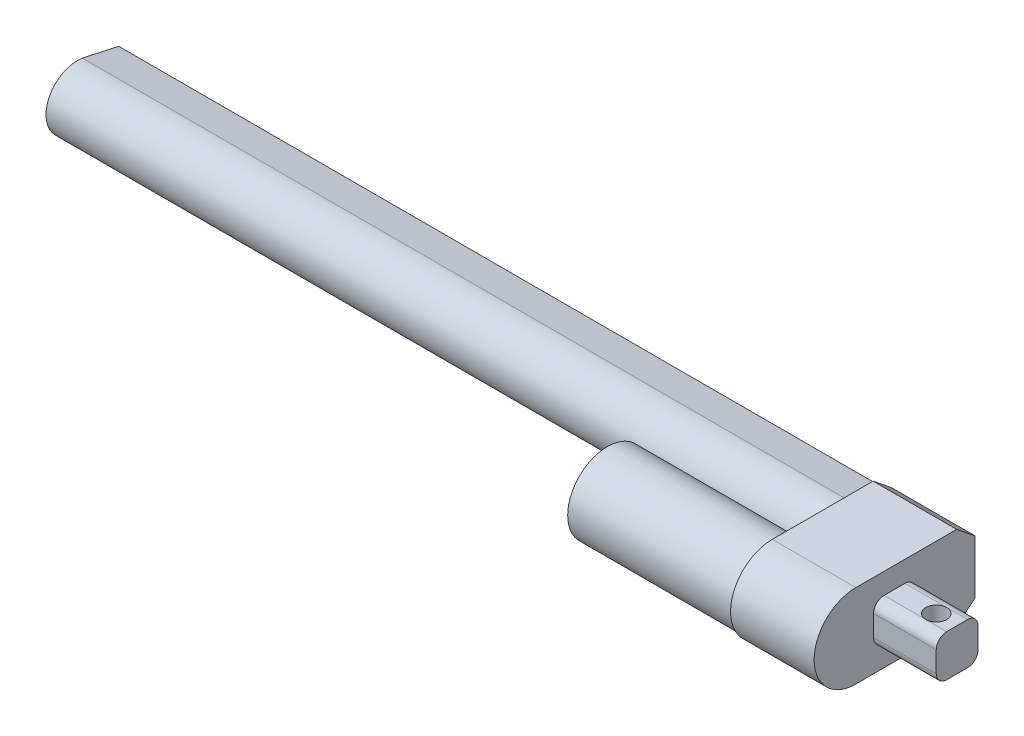
ISO-10303-21;
HEADER;
FILE_DESCRIPTION(('STEP AP214'),'2;1');
FILE_NAME('part.step','',(''),(''),'','','');
FILE_SCHEMA(('AUTOMOTIVE_DESIGN { 1 0 10303 214 1 1 1 1 }'));
ENDSEC;
DATA;
#1=APPLICATION_CONTEXT('core data for automotive mechanical design processes');
#2=APPLICATION_PROTOCOL_DEFINITION('international standard','automotive_design',2000,#1);
#3=PRODUCT_CONTEXT('',#1,'mechanical');
#4=PRODUCT('Part','Part','',(#3));
#5=PRODUCT_RELATED_PRODUCT_CATEGORY('part','',(#4));
#6=PRODUCT_DEFINITION_FORMATION('','',#4);
#7=PRODUCT_DEFINITION_CONTEXT('part definition',#1,'design');
#8=PRODUCT_DEFINITION('design','',#6,#7);
#9=PRODUCT_DEFINITION_SHAPE('','',#8);
#10=(LENGTH_UNIT() NAMED_UNIT(*) SI_UNIT(.MILLI.,.METRE.));
#11=(NAMED_UNIT(*) PLANE_ANGLE_UNIT() SI_UNIT($,.RADIAN.));
#12=(NAMED_UNIT(*) SI_UNIT($,.STERADIAN.) SOLID_ANGLE_UNIT());
#13=UNCERTAINTY_MEASURE_WITH_UNIT(LENGTH_MEASURE(1.E-05),#10,'distance_accuracy_value','');
#14=(GEOMETRIC_REPRESENTATION_CONTEXT(3) GLOBAL_UNCERTAINTY_ASSIGNED_CONTEXT((#13)) GLOBAL_UNIT_ASSIGNED_CONTEXT((#10,
#11,#12)) REPRESENTATION_CONTEXT('',''));
#15=CARTESIAN_POINT('',(0.,0.,0.));
#16=DIRECTION('',(0.,0.,1.));
#17=DIRECTION('',(1.,0.,0.));
#18=AXIS2_PLACEMENT_3D('',#15,#16,#17);
#19=CARTESIAN_POINT('',(440.,-1.00000000000001,43.5));
#20=DIRECTION('',(0.,-1.,0.));
#21=DIRECTION('',(0.,0.,-1.));
#22=AXIS2_PLACEMENT_3D('',#19,#20,#21);
#23=PLANE('',#22);
#24=DIRECTION('',(-1.,0.,0.));
#25=VECTOR('',#24,1.);
#26=CARTESIAN_POINT('',(440.,-1.00000000000001,33.5));
#27=LINE('',#26,#25);
#28=CARTESIAN_POINT('',(440.,-1.00000000000001,33.5));
#29=VERTEX_POINT('',#28);
#30=CARTESIAN_POINT('',(430.,-1.00000000000001,33.5));
#31=VERTEX_POINT('',#30);
#32=EDGE_CURVE('E184',#29,#31,#27,.T.);
#33=ORIENTED_EDGE('',*,*,#32,.T.);
#34=CARTESIAN_POINT('',(430.,-1.00000000000001,38.5));
#35=DIRECTION('',(0.,1.,0.));
#36=DIRECTION('',(0.,0.,1.));
#37=AXIS2_PLACEMENT_3D('',#34,#35,#36);
#38=CIRCLE('',#37,4.99999999999999);
#39=CARTESIAN_POINT('',(430.,-1.00000000000001,43.5));
#40=VERTEX_POINT('',#39);
#41=EDGE_CURVE('E50',#40,#31,#38,.T.);
#42=ORIENTED_EDGE('',*,*,#41,.F.);
#43=DIRECTION('',(-1.,0.,0.));
#44=VECTOR('',#43,1.);
#45=CARTESIAN_POINT('',(440.,-1.00000000000001,43.5));
#46=LINE('',#45,#44);
#47=CARTESIAN_POINT('',(440.,-1.00000000000001,43.5));
#48=VERTEX_POINT('',#47);
#49=EDGE_CURVE('E181',#48,#40,#46,.T.);
#50=ORIENTED_EDGE('',*,*,#49,.F.);
#51=DIRECTION('',(0.,0.,1.));
#52=VECTOR('',#51,1.);
#53=CARTESIAN_POINT('',(440.,-1.00000000000001,43.5));
#54=LINE('',#53,#52);
#55=EDGE_CURVE('E348',#29,#48,#54,.T.);
#56=ORIENTED_EDGE('',*,*,#55,.F.);
#57=EDGE_LOOP('',(#33,#42,#50,#56));
#58=FACE_BOUND('',#57,.T.);
#59=ADVANCED_FACE('F36',(#58),#23,.F.);
#60=CARTESIAN_POINT('',(440.,-21.,43.5));
#61=DIRECTION('',(0.,1.,0.));
#62=DIRECTION('',(0.,0.,1.));
#63=AXIS2_PLACEMENT_3D('',#60,#61,#62);
#64=PLANE('',#63);
#65=DIRECTION('',(-1.,0.,0.));
#66=VECTOR('',#65,1.);
#67=CARTESIAN_POINT('',(440.,-21.,43.5));
#68=LINE('',#67,#66);
#69=CARTESIAN_POINT('',(440.,-21.,43.5));
#70=VERTEX_POINT('',#69);
#71=CARTESIAN_POINT('',(430.,-21.,43.5));
#72=VERTEX_POINT('',#71);
#73=EDGE_CURVE('E298',#70,#72,#68,.T.);
#74=ORIENTED_EDGE('',*,*,#73,.T.);
#75=CARTESIAN_POINT('',(430.,-21.,38.5));
#76=DIRECTION('',(0.,1.,0.));
#77=DIRECTION('',(0.,0.,1.));
#78=AXIS2_PLACEMENT_3D('',#75,#76,#77);
#79=CIRCLE('',#78,4.99999999999999);
#80=CARTESIAN_POINT('',(430.,-21.,33.5));
#81=VERTEX_POINT('',#80);
#82=EDGE_CURVE('E44',#72,#81,#79,.T.);
#83=ORIENTED_EDGE('',*,*,#82,.T.);
#84=DIRECTION('',(-1.,0.,0.));
#85=VECTOR('',#84,1.);
#86=CARTESIAN_POINT('',(440.,-21.,33.5));
#87=LINE('',#86,#85);
#88=CARTESIAN_POINT('',(440.,-21.,33.5));
#89=VERTEX_POINT('',#88);
#90=EDGE_CURVE('E295',#89,#81,#87,.T.);
#91=ORIENTED_EDGE('',*,*,#90,.F.);
#92=DIRECTION('',(0.,0.,-1.));
#93=VECTOR('',#92,1.);
#94=CARTESIAN_POINT('',(440.,-21.,43.5));
#95=LINE('',#94,#93);
#96=EDGE_CURVE('E309',#70,#89,#95,.T.);
#97=ORIENTED_EDGE('',*,*,#96,.F.);
#98=EDGE_LOOP('',(#74,#83,#91,#97));
#99=FACE_BOUND('',#98,.T.);
#100=ADVANCED_FACE('F292',(#99),#64,.F.);
#101=CARTESIAN_POINT('',(370.,0.,0.));
#102=DIRECTION('',(0.,0.,-1.));
#103=DIRECTION('',(0.,1.,0.));
#104=AXIS2_PLACEMENT_3D('',#101,#102,#103);
#105=PLANE('',#104);
#106=DIRECTION('',(0.,-1.,0.));
#107=VECTOR('',#106,1.);
#108=CARTESIAN_POINT('',(0.,0.,0.));
#109=LINE('',#108,#107);
#110=CARTESIAN_POINT('',(0.,0.,0.));
#111=VERTEX_POINT('',#110);
#112=CARTESIAN_POINT('',(0.,-22.,0.));
#113=VERTEX_POINT('',#112);
#114=EDGE_CURVE('E259',#111,#113,#109,.T.);
#115=ORIENTED_EDGE('',*,*,#114,.F.);
#116=DIRECTION('',(-1.,0.,0.));
#117=VECTOR('',#116,1.);
#118=CARTESIAN_POINT('',(370.,0.,0.));
#119=LINE('',#118,#117);
#120=CARTESIAN_POINT('',(370.,0.,0.));
#121=VERTEX_POINT('',#120);
#122=EDGE_CURVE('E282',#121,#111,#119,.T.);
#123=ORIENTED_EDGE('',*,*,#122,.F.);
#124=DIRECTION('',(0.,1.,0.));
#125=VECTOR('',#124,1.);
#126=CARTESIAN_POINT('',(370.,-11.,0.));
#127=LINE('',#126,#125);
#128=CARTESIAN_POINT('',(370.,2.,0.));
#129=VERTEX_POINT('',#128);
#130=EDGE_CURVE('E210',#121,#129,#127,.T.);
#131=ORIENTED_EDGE('',*,*,#130,.T.);
#132=DIRECTION('',(-1.,0.,0.));
#133=VECTOR('',#132,1.);
#134=CARTESIAN_POINT('',(410.,2.,0.));
#135=LINE('',#134,#133);
#136=CARTESIAN_POINT('',(410.,2.,0.));
#137=VERTEX_POINT('',#136);
#138=EDGE_CURVE('E252',#137,#129,#135,.T.);
#139=ORIENTED_EDGE('',*,*,#138,.F.);
#140=DIRECTION('',(0.,1.,0.));
#141=VECTOR('',#140,1.);
#142=CARTESIAN_POINT('',(410.,-24.,0.));
#143=LINE('',#142,#141);
#144=CARTESIAN_POINT('',(410.,-24.,0.));
#145=VERTEX_POINT('',#144);
#146=EDGE_CURVE('E211',#145,#137,#143,.T.);
#147=ORIENTED_EDGE('',*,*,#146,.F.);
#148=DIRECTION('',(-1.,0.,0.));
#149=VECTOR('',#148,1.);
#150=CARTESIAN_POINT('',(410.,-24.,0.));
#151=LINE('',#150,#149);
#152=CARTESIAN_POINT('',(370.,-24.,0.));
#153=VERTEX_POINT('',#152);
#154=EDGE_CURVE('E224',#145,#153,#151,.T.);
#155=ORIENTED_EDGE('',*,*,#154,.T.);
#156=CARTESIAN_POINT('',(370.,-22.,0.));
#157=VERTEX_POINT('',#156);
#158=EDGE_CURVE('E225',#153,#157,#127,.T.);
#159=ORIENTED_EDGE('',*,*,#158,.T.);
#160=DIRECTION('',(-1.,0.,0.));
#161=VECTOR('',#160,1.);
#162=CARTESIAN_POINT('',(370.,-22.,0.));
#163=LINE('',#162,#161);
#164=EDGE_CURVE('E271',#157,#113,#163,.T.);
#165=ORIENTED_EDGE('',*,*,#164,.T.);
#166=EDGE_LOOP('',(#115,#123,#131,#139,#147,#155,#159,#165));
#167=FACE_BOUND('',#166,.T.);
#168=ADVANCED_FACE('F38',(#167),#105,.T.);
#169=CARTESIAN_POINT('',(370.,0.,0.));
#170=DIRECTION('',(0.,-0.976971020538512,0.213372034315506));
#171=DIRECTION('',(0.,-0.213372034315506,-0.976971020538513));
#172=AXIS2_PLACEMENT_3D('',#169,#170,#171);
#173=PLANE('',#172);
#174=DIRECTION('',(0.,0.213372034315506,0.976971020538513));
#175=VECTOR('',#174,1.);
#176=CARTESIAN_POINT('',(0.,0.,0.));
#177=LINE('',#176,#175);
#178=CARTESIAN_POINT('',(0.,3.8039516146193,17.4172332514696));
#179=VERTEX_POINT('',#178);
#180=EDGE_CURVE('E266',#111,#179,#177,.T.);
#181=ORIENTED_EDGE('',*,*,#180,.T.);
#182=DIRECTION('',(-1.,0.,0.));
#183=VECTOR('',#182,1.);
#184=CARTESIAN_POINT('',(370.,3.8039516146193,17.4172332514696));
#185=LINE('',#184,#183);
#186=CARTESIAN_POINT('',(370.,3.8039516146193,17.4172332514696));
#187=VERTEX_POINT('',#186);
#188=EDGE_CURVE('E284',#187,#179,#185,.T.);
#189=ORIENTED_EDGE('',*,*,#188,.F.);
#190=DIRECTION('',(0.,0.213372034315506,0.976971020538513));
#191=VECTOR('',#190,1.);
#192=CARTESIAN_POINT('',(370.,0.,0.));
#193=LINE('',#192,#191);
#194=EDGE_CURVE('E269',#121,#187,#193,.T.);
#195=ORIENTED_EDGE('',*,*,#194,.F.);
#196=ORIENTED_EDGE('',*,*,#122,.T.);
#197=EDGE_LOOP('',(#181,#189,#195,#196));
#198=FACE_BOUND('',#197,.T.);
#199=ADVANCED_FACE('F436',(#198),#173,.F.);
#200=CARTESIAN_POINT('',(370.,-11.,19.8344665029393));
#201=DIRECTION('',(-1.,0.,0.));
#202=DIRECTION('',(0.,0.,1.));
#203=AXIS2_PLACEMENT_3D('',#200,#201,#202);
#204=CYLINDRICAL_SURFACE('',#203,15.);
#205=CARTESIAN_POINT('',(0.,-11.,19.8344665029393));
#206=DIRECTION('',(-1.,0.,0.));
#207=DIRECTION('',(0.,0.,1.));
#208=AXIS2_PLACEMENT_3D('',#205,#206,#207);
#209=CIRCLE('',#208,15.);
#210=CARTESIAN_POINT('',(0.,-25.8039516146193,17.4172332514696));
#211=VERTEX_POINT('',#210);
#212=EDGE_CURVE('E277',#211,#179,#209,.T.);
#213=ORIENTED_EDGE('',*,*,#212,.F.);
#214=DIRECTION('',(-1.,0.,0.));
#215=VECTOR('',#214,1.);
#216=CARTESIAN_POINT('',(370.,-25.8039516146193,17.4172332514696));
#217=LINE('',#216,#215);
#218=CARTESIAN_POINT('',(370.,-25.8039516146193,17.4172332514696));
#219=VERTEX_POINT('',#218);
#220=EDGE_CURVE('E286',#219,#211,#217,.T.);
#221=ORIENTED_EDGE('',*,*,#220,.F.);
#222=CARTESIAN_POINT('',(370.,-11.,19.8344665029393));
#223=DIRECTION('',(-1.,0.,0.));
#224=DIRECTION('',(0.,0.,1.));
#225=AXIS2_PLACEMENT_3D('',#222,#223,#224);
#226=CIRCLE('',#225,15.);
#227=EDGE_CURVE('E265',#219,#187,#226,.T.);
#228=ORIENTED_EDGE('',*,*,#227,.T.);
#229=ORIENTED_EDGE('',*,*,#188,.T.);
#230=EDGE_LOOP('',(#213,#221,#228,#229));
#231=FACE_BOUND('',#230,.T.);
#232=ADVANCED_FACE('F439',(#231),#204,.T.);
#233=CARTESIAN_POINT('',(370.,-22.,0.));
#234=DIRECTION('',(0.,-0.976971020538512,-0.213372034315506));
#235=DIRECTION('',(0.,0.213372034315506,-0.976971020538512));
#236=AXIS2_PLACEMENT_3D('',#233,#234,#235);
#237=PLANE('',#236);
#238=DIRECTION('',(0.,-0.213372034315506,0.976971020538512));
#239=VECTOR('',#238,1.);
#240=CARTESIAN_POINT('',(0.,-22.,0.));
#241=LINE('',#240,#239);
#242=EDGE_CURVE('E274',#113,#211,#241,.T.);
#243=ORIENTED_EDGE('',*,*,#242,.F.);
#244=ORIENTED_EDGE('',*,*,#164,.F.);
#245=DIRECTION('',(0.,-0.213372034315506,0.976971020538512));
#246=VECTOR('',#245,1.);
#247=CARTESIAN_POINT('',(370.,-22.,0.));
#248=LINE('',#247,#246);
#249=EDGE_CURVE('E262',#157,#219,#248,.T.);
#250=ORIENTED_EDGE('',*,*,#249,.T.);
#251=ORIENTED_EDGE('',*,*,#220,.T.);
#252=EDGE_LOOP('',(#243,#244,#250,#251));
#253=FACE_BOUND('',#252,.T.);
#254=ADVANCED_FACE('F434',(#253),#237,.T.);
#255=CARTESIAN_POINT('',(0.,-11.,19.8344665029393));
#256=DIRECTION('',(-1.,0.,0.));
#257=DIRECTION('',(0.,0.,1.));
#258=AXIS2_PLACEMENT_3D('',#255,#256,#257);
#259=PLANE('',#258);
#260=CARTESIAN_POINT('',(0.,-11.,19.82));
#261=DIRECTION('',(-1.,0.,0.));
#262=DIRECTION('',(0.,0.,1.));
#263=AXIS2_PLACEMENT_3D('',#260,#261,#262);
#264=CIRCLE('',#263,10.);
#265=CARTESIAN_POINT('',(0.,-11.,29.82));
#266=VERTEX_POINT('',#265);
#267=EDGE_CURVE('E255',#266,#266,#264,.T.);
#268=ORIENTED_EDGE('',*,*,#267,.F.);
#269=EDGE_LOOP('',(#268));
#270=FACE_BOUND('',#269,.T.);
#271=ORIENTED_EDGE('',*,*,#114,.T.);
#272=ORIENTED_EDGE('',*,*,#242,.T.);
#273=ORIENTED_EDGE('',*,*,#212,.T.);
#274=ORIENTED_EDGE('',*,*,#180,.F.);
#275=EDGE_LOOP('',(#271,#272,#273,#274));
#276=FACE_BOUND('',#275,.T.);
#277=ADVANCED_FACE('F430',(#270,#276),#259,.T.);
#278=CARTESIAN_POINT('',(360.,-11.,19.82));
#279=DIRECTION('',(-1.,0.,0.));
#280=DIRECTION('',(0.,0.,1.));
#281=AXIS2_PLACEMENT_3D('',#278,#279,#280);
#282=CYLINDRICAL_SURFACE('',#281,10.);
#283=CARTESIAN_POINT('',(360.,-11.,19.82));
#284=DIRECTION('',(-1.,0.,0.));
#285=DIRECTION('',(0.,0.,1.));
#286=AXIS2_PLACEMENT_3D('',#283,#284,#285);
#287=CIRCLE('',#286,10.);
#288=CARTESIAN_POINT('',(360.,-11.,29.82));
#289=VERTEX_POINT('',#288);
#290=EDGE_CURVE('E256',#289,#289,#287,.T.);
#291=CARTESIAN_POINT('',(360.,-11.,29.82));
#292=CARTESIAN_POINT('',(356.25,-11.,29.82));
#293=CARTESIAN_POINT('',(352.5,-11.,29.82));
#294=CARTESIAN_POINT('',(345.,-11.,29.82));
#295=CARTESIAN_POINT('',(341.25,-11.,29.82));
#296=CARTESIAN_POINT('',(333.75,-11.,29.82));
#297=CARTESIAN_POINT('',(330.,-11.,29.82));
#298=CARTESIAN_POINT('',(322.5,-11.,29.82));
#299=CARTESIAN_POINT('',(318.75,-11.,29.82));
#300=CARTESIAN_POINT('',(311.25,-11.,29.82));
#301=CARTESIAN_POINT('',(307.5,-11.,29.82));
#302=CARTESIAN_POINT('',(300.,-11.,29.82));
#303=CARTESIAN_POINT('',(296.25,-11.,29.82));
#304=CARTESIAN_POINT('',(288.75,-11.,29.82));
#305=CARTESIAN_POINT('',(285.,-11.,29.82));
#306=CARTESIAN_POINT('',(277.5,-11.,29.82));
#307=CARTESIAN_POINT('',(273.75,-11.,29.82));
#308=CARTESIAN_POINT('',(266.25,-11.,29.82));
#309=CARTESIAN_POINT('',(262.5,-11.,29.82));
#310=CARTESIAN_POINT('',(255.,-11.,29.82));
#311=CARTESIAN_POINT('',(251.25,-11.,29.82));
#312=CARTESIAN_POINT('',(243.75,-11.,29.82));
#313=CARTESIAN_POINT('',(240.,-11.,29.82));
#314=CARTESIAN_POINT('',(232.5,-11.,29.82));
#315=CARTESIAN_POINT('',(228.75,-11.,29.82));
#316=CARTESIAN_POINT('',(221.25,-11.,29.82));
#317=CARTESIAN_POINT('',(217.5,-11.,29.82));
#318=CARTESIAN_POINT('',(210.,-11.,29.82));
#319=CARTESIAN_POINT('',(206.25,-11.,29.82));
#320=CARTESIAN_POINT('',(198.75,-11.,29.82));
#321=CARTESIAN_POINT('',(195.,-11.,29.82));
#322=CARTESIAN_POINT('',(187.5,-11.,29.82));
#323=CARTESIAN_POINT('',(183.75,-11.,29.82));
#324=CARTESIAN_POINT('',(176.25,-11.,29.82));
#325=CARTESIAN_POINT('',(172.5,-11.,29.82));
#326=CARTESIAN_POINT('',(165.,-11.,29.82));
#327=CARTESIAN_POINT('',(161.25,-11.,29.82));
#328=CARTESIAN_POINT('',(153.75,-11.,29.82));
#329=CARTESIAN_POINT('',(150.,-11.,29.82));
#330=CARTESIAN_POINT('',(142.5,-11.,29.82));
#331=CARTESIAN_POINT('',(138.75,-11.,29.82));
#332=CARTESIAN_POINT('',(131.25,-11.,29.82));
#333=CARTESIAN_POINT('',(127.5,-11.,29.82));
#334=CARTESIAN_POINT('',(120.,-11.,29.82));
#335=CARTESIAN_POINT('',(116.25,-11.,29.82));
#336=CARTESIAN_POINT('',(108.75,-11.,29.82));
#337=CARTESIAN_POINT('',(105.,-11.,29.82));
#338=CARTESIAN_POINT('',(97.5,-11.,29.82));
#339=CARTESIAN_POINT('',(93.75,-11.,29.82));
#340=CARTESIAN_POINT('',(86.25,-11.,29.82));
#341=CARTESIAN_POINT('',(82.5,-11.,29.82));
#342=CARTESIAN_POINT('',(75.0000000000001,-11.,29.82));
#343=CARTESIAN_POINT('',(71.25,-11.,29.82));
#344=CARTESIAN_POINT('',(63.7500000000001,-11.,29.82));
#345=CARTESIAN_POINT('',(60.0000000000001,-11.,29.82));
#346=CARTESIAN_POINT('',(52.5000000000001,-11.,29.82));
#347=CARTESIAN_POINT('',(48.75,-11.,29.82));
#348=CARTESIAN_POINT('',(41.25,-11.,29.82));
#349=CARTESIAN_POINT('',(37.5000000000001,-11.,29.82));
#350=CARTESIAN_POINT('',(30.0000000000001,-11.,29.82));
#351=CARTESIAN_POINT('',(26.2500000000001,-11.,29.82));
#352=CARTESIAN_POINT('',(18.7500000000001,-11.,29.82));
#353=CARTESIAN_POINT('',(15.,-11.,29.82));
#354=CARTESIAN_POINT('',(7.50000000000004,-11.,29.82));
#355=CARTESIAN_POINT('',(3.75000000000005,-11.,29.82));
#356=CARTESIAN_POINT('',(0.,-11.,29.82));
#357=B_SPLINE_CURVE_WITH_KNOTS('',3,(#291,#292,#293,#294,#295,#296,#297,#298,#299,#300,#301,
#302,#303,#304,#305,#306,#307,#308,#309,#310,#311,#312,#313,#314,#315,#316,#317,#318,#319,#320,
#321,#322,#323,#324,#325,#326,#327,#328,#329,#330,#331,#332,#333,#334,#335,#336,#337,#338,#339,
#340,#341,#342,#343,#344,#345,#346,#347,#348,#349,#350,#351,#352,#353,#354,#355,#356),
.UNSPECIFIED.,.F.,.F.,(4,2,2,2,2,2,2,2,2,2,2,2,2,2,2,2,2,2,2,2,2,2,2,2,2,2,2,2,2,2,2,2,4),(0.,
11.25,22.5,33.7499999999999,45.,56.25,67.4999999999999,78.75,90.,101.25,112.5,123.75,135.,
146.25,157.5,168.75,180.,191.25,202.5,213.75,225.,236.25,247.5,258.75,270.,281.25,292.5,303.75,
315.,326.25,337.5,348.75,360.),.UNSPECIFIED.);
#358=EDGE_CURVE('BSEAM426',#289,#266,#357,.T.);
#359=ORIENTED_EDGE('',*,*,#290,.F.);
#360=ORIENTED_EDGE('',*,*,#267,.T.);
#361=ORIENTED_EDGE('',*,*,#358,.T.);
#362=ORIENTED_EDGE('',*,*,#358,.F.);
#363=EDGE_LOOP('',(#359,#361,#360,#362));
#364=FACE_BOUND('',#363,.T.);
#365=ADVANCED_FACE('F426',(#364),#282,.F.);
#366=CARTESIAN_POINT('',(360.,-11.,19.82));
#367=DIRECTION('',(-1.,0.,0.));
#368=DIRECTION('',(0.,0.,1.));
#369=AXIS2_PLACEMENT_3D('',#366,#367,#368);
#370=PLANE('',#369);
#371=ORIENTED_EDGE('',*,*,#290,.T.);
#372=EDGE_LOOP('',(#371));
#373=FACE_BOUND('',#372,.T.);
#374=ADVANCED_FACE('F404',(#373),#370,.T.);
#375=CARTESIAN_POINT('',(370.,-11.,57.));
#376=DIRECTION('',(1.,0.,0.));
#377=DIRECTION('',(0.,0.,-1.));
#378=AXIS2_PLACEMENT_3D('',#375,#376,#377);
#379=PLANE('',#378);
#380=CARTESIAN_POINT('',(370.,-11.,57.));
#381=DIRECTION('',(1.,0.,0.));
#382=DIRECTION('',(0.,0.,-1.));
#383=AXIS2_PLACEMENT_3D('',#380,#381,#382);
#384=CIRCLE('',#383,19.);
#385=CARTESIAN_POINT('',(370.,-11.,38.));
#386=VERTEX_POINT('',#385);
#387=EDGE_CURVE('E11',#386,#386,#384,.F.);
#388=ORIENTED_EDGE('',*,*,#387,.F.);
#389=EDGE_LOOP('',(#388));
#390=FACE_BOUND('',#389,.T.);
#391=ORIENTED_EDGE('',*,*,#130,.F.);
#392=ORIENTED_EDGE('',*,*,#194,.T.);
#393=ORIENTED_EDGE('',*,*,#227,.F.);
#394=ORIENTED_EDGE('',*,*,#249,.F.);
#395=ORIENTED_EDGE('',*,*,#158,.F.);
#396=DIRECTION('',(0.,0.626500113299918,-0.779421328958343));
#397=VECTOR('',#396,1.);
#398=CARTESIAN_POINT('',(370.,-24.,0.));
#399=LINE('',#398,#397);
#400=CARTESIAN_POINT('',(370.,-31.,8.7086166257348));
#401=VERTEX_POINT('',#400);
#402=EDGE_CURVE('E214',#401,#153,#399,.T.);
#403=ORIENTED_EDGE('',*,*,#402,.F.);
#404=DIRECTION('',(0.,0.,-1.));
#405=VECTOR('',#404,1.);
#406=CARTESIAN_POINT('',(370.,-31.,57.));
#407=LINE('',#406,#405);
#408=CARTESIAN_POINT('',(370.,-31.,57.));
#409=VERTEX_POINT('',#408);
#410=EDGE_CURVE('E234',#409,#401,#407,.T.);
#411=ORIENTED_EDGE('',*,*,#410,.F.);
#412=CARTESIAN_POINT('',(370.,-11.,57.));
#413=DIRECTION('',(1.,0.,0.));
#414=DIRECTION('',(0.,0.,-1.));
#415=AXIS2_PLACEMENT_3D('',#412,#413,#414);
#416=CIRCLE('',#415,20.);
#417=CARTESIAN_POINT('',(370.,8.99999999999999,57.));
#418=VERTEX_POINT('',#417);
#419=EDGE_CURVE('E232',#418,#409,#416,.T.);
#420=ORIENTED_EDGE('',*,*,#419,.F.);
#421=DIRECTION('',(0.,0.,1.));
#422=VECTOR('',#421,1.);
#423=CARTESIAN_POINT('',(370.,8.99999999999999,8.70861662573482));
#424=LINE('',#423,#422);
#425=CARTESIAN_POINT('',(370.,8.99999999999999,8.70861662573482));
#426=VERTEX_POINT('',#425);
#427=EDGE_CURVE('E230',#426,#418,#424,.T.);
#428=ORIENTED_EDGE('',*,*,#427,.F.);
#429=DIRECTION('',(0.,0.626500113299917,0.779421328958344));
#430=VECTOR('',#429,1.);
#431=CARTESIAN_POINT('',(370.,2.,0.));
#432=LINE('',#431,#430);
#433=EDGE_CURVE('E228',#129,#426,#432,.T.);
#434=ORIENTED_EDGE('',*,*,#433,.F.);
#435=EDGE_LOOP('',(#391,#392,#393,#394,#395,#403,#411,#420,#428,#434));
#436=FACE_BOUND('',#435,.T.);
#437=ADVANCED_FACE('F400',(#390,#436),#379,.F.);
#438=CARTESIAN_POINT('',(410.,2.,0.));
#439=DIRECTION('',(0.,-0.779421328958344,0.626500113299917));
#440=DIRECTION('',(0.,-0.626500113299917,-0.779421328958344));
#441=AXIS2_PLACEMENT_3D('',#438,#439,#440);
#442=PLANE('',#441);
#443=ORIENTED_EDGE('',*,*,#433,.T.);
#444=DIRECTION('',(-1.,0.,0.));
#445=VECTOR('',#444,1.);
#446=CARTESIAN_POINT('',(410.,8.99999999999999,8.70861662573482));
#447=LINE('',#446,#445);
#448=CARTESIAN_POINT('',(410.,8.99999999999999,8.70861662573482));
#449=VERTEX_POINT('',#448);
#450=EDGE_CURVE('E249',#449,#426,#447,.T.);
#451=ORIENTED_EDGE('',*,*,#450,.F.);
#452=DIRECTION('',(0.,0.626500113299917,0.779421328958344));
#453=VECTOR('',#452,1.);
#454=CARTESIAN_POINT('',(410.,2.,0.));
#455=LINE('',#454,#453);
#456=EDGE_CURVE('E213',#137,#449,#455,.T.);
#457=ORIENTED_EDGE('',*,*,#456,.F.);
#458=ORIENTED_EDGE('',*,*,#138,.T.);
#459=EDGE_LOOP('',(#443,#451,#457,#458));
#460=FACE_BOUND('',#459,.T.);
#461=ADVANCED_FACE('F403',(#460),#442,.F.);
#462=CARTESIAN_POINT('',(410.,8.99999999999999,8.70861662573482));
#463=DIRECTION('',(0.,-1.,0.));
#464=DIRECTION('',(0.,0.,-1.));
#465=AXIS2_PLACEMENT_3D('',#462,#463,#464);
#466=PLANE('',#465);
#467=ORIENTED_EDGE('',*,*,#427,.T.);
#468=DIRECTION('',(-1.,0.,0.));
#469=VECTOR('',#468,1.);
#470=CARTESIAN_POINT('',(410.,8.99999999999999,57.));
#471=LINE('',#470,#469);
#472=CARTESIAN_POINT('',(410.,8.99999999999999,57.));
#473=VERTEX_POINT('',#472);
#474=EDGE_CURVE('E246',#473,#418,#471,.T.);
#475=ORIENTED_EDGE('',*,*,#474,.F.);
#476=DIRECTION('',(0.,0.,1.));
#477=VECTOR('',#476,1.);
#478=CARTESIAN_POINT('',(410.,8.99999999999999,8.70861662573482));
#479=LINE('',#478,#477);
#480=EDGE_CURVE('E216',#449,#473,#479,.T.);
#481=ORIENTED_EDGE('',*,*,#480,.F.);
#482=ORIENTED_EDGE('',*,*,#450,.T.);
#483=EDGE_LOOP('',(#467,#475,#481,#482));
#484=FACE_BOUND('',#483,.T.);
#485=ADVANCED_FACE('F416',(#484),#466,.F.);
#486=CARTESIAN_POINT('',(410.,-11.,57.));
#487=DIRECTION('',(-1.,0.,0.));
#488=DIRECTION('',(0.,0.,1.));
#489=AXIS2_PLACEMENT_3D('',#486,#487,#488);
#490=CYLINDRICAL_SURFACE('',#489,20.);
#491=ORIENTED_EDGE('',*,*,#419,.T.);
#492=DIRECTION('',(-1.,0.,0.));
#493=VECTOR('',#492,1.);
#494=CARTESIAN_POINT('',(410.,-31.,57.));
#495=LINE('',#494,#493);
#496=CARTESIAN_POINT('',(410.,-31.,57.));
#497=VERTEX_POINT('',#496);
#498=EDGE_CURVE('E243',#497,#409,#495,.T.);
#499=ORIENTED_EDGE('',*,*,#498,.F.);
#500=CARTESIAN_POINT('',(410.,-11.,57.));
#501=DIRECTION('',(1.,0.,0.));
#502=DIRECTION('',(0.,0.,-1.));
#503=AXIS2_PLACEMENT_3D('',#500,#501,#502);
#504=CIRCLE('',#503,20.);
#505=EDGE_CURVE('E218',#473,#497,#504,.T.);
#506=ORIENTED_EDGE('',*,*,#505,.F.);
#507=ORIENTED_EDGE('',*,*,#474,.T.);
#508=EDGE_LOOP('',(#491,#499,#506,#507));
#509=FACE_BOUND('',#508,.T.);
#510=ADVANCED_FACE('F412',(#509),#490,.T.);
#511=CARTESIAN_POINT('',(410.,-31.,57.));
#512=DIRECTION('',(0.,1.,0.));
#513=DIRECTION('',(0.,0.,1.));
#514=AXIS2_PLACEMENT_3D('',#511,#512,#513);
#515=PLANE('',#514);
#516=ORIENTED_EDGE('',*,*,#410,.T.);
#517=DIRECTION('',(-1.,0.,0.));
#518=VECTOR('',#517,1.);
#519=CARTESIAN_POINT('',(410.,-31.,8.7086166257348));
#520=LINE('',#519,#518);
#521=CARTESIAN_POINT('',(410.,-31.,8.7086166257348));
#522=VERTEX_POINT('',#521);
#523=EDGE_CURVE('E240',#522,#401,#520,.T.);
#524=ORIENTED_EDGE('',*,*,#523,.F.);
#525=DIRECTION('',(0.,0.,-1.));
#526=VECTOR('',#525,1.);
#527=CARTESIAN_POINT('',(410.,-31.,57.));
#528=LINE('',#527,#526);
#529=EDGE_CURVE('E220',#497,#522,#528,.T.);
#530=ORIENTED_EDGE('',*,*,#529,.F.);
#531=ORIENTED_EDGE('',*,*,#498,.T.);
#532=EDGE_LOOP('',(#516,#524,#530,#531));
#533=FACE_BOUND('',#532,.T.);
#534=ADVANCED_FACE('F408',(#533),#515,.F.);
#535=CARTESIAN_POINT('',(410.,-24.,0.));
#536=DIRECTION('',(0.,0.779421328958343,0.626500113299918));
#537=DIRECTION('',(0.,-0.626500113299918,0.779421328958343));
#538=AXIS2_PLACEMENT_3D('',#535,#536,#537);
#539=PLANE('',#538);
#540=ORIENTED_EDGE('',*,*,#402,.T.);
#541=ORIENTED_EDGE('',*,*,#154,.F.);
#542=DIRECTION('',(0.,0.626500113299918,-0.779421328958343));
#543=VECTOR('',#542,1.);
#544=CARTESIAN_POINT('',(410.,-24.,0.));
#545=LINE('',#544,#543);
#546=EDGE_CURVE('E222',#522,#145,#545,.T.);
#547=ORIENTED_EDGE('',*,*,#546,.F.);
#548=ORIENTED_EDGE('',*,*,#523,.T.);
#549=EDGE_LOOP('',(#540,#541,#547,#548));
#550=FACE_BOUND('',#549,.T.);
#551=ADVANCED_FACE('F399',(#550),#539,.F.);
#552=CARTESIAN_POINT('',(410.,-11.,57.));
#553=DIRECTION('',(1.,0.,0.));
#554=DIRECTION('',(0.,0.,-1.));
#555=AXIS2_PLACEMENT_3D('',#552,#553,#554);
#556=PLANE('',#555);
#557=CARTESIAN_POINT('',(410.,-16.,33.5));
#558=DIRECTION('',(1.,0.,0.));
#559=DIRECTION('',(0.,0.,1.));
#560=AXIS2_PLACEMENT_3D('',#557,#558,#559);
#561=CIRCLE('',#560,5.);
#562=CARTESIAN_POINT('',(410.,-21.,33.5));
#563=VERTEX_POINT('',#562);
#564=CARTESIAN_POINT('',(410.,-16.,28.5));
#565=VERTEX_POINT('',#564);
#566=EDGE_CURVE('E355',#563,#565,#561,.T.);
#567=ORIENTED_EDGE('',*,*,#566,.F.);
#568=DIRECTION('',(0.,0.,-1.));
#569=VECTOR('',#568,1.);
#570=CARTESIAN_POINT('',(410.,-21.,43.5));
#571=LINE('',#570,#569);
#572=CARTESIAN_POINT('',(410.,-21.,43.5));
#573=VERTEX_POINT('',#572);
#574=EDGE_CURVE('E305',#573,#563,#571,.T.);
#575=ORIENTED_EDGE('',*,*,#574,.F.);
#576=CARTESIAN_POINT('',(410.,-16.,43.5));
#577=DIRECTION('',(1.,0.,0.));
#578=DIRECTION('',(0.,0.,-1.));
#579=AXIS2_PLACEMENT_3D('',#576,#577,#578);
#580=CIRCLE('',#579,5.);
#581=CARTESIAN_POINT('',(410.,-16.,48.5));
#582=VERTEX_POINT('',#581);
#583=EDGE_CURVE('E335',#582,#573,#580,.T.);
#584=ORIENTED_EDGE('',*,*,#583,.F.);
#585=DIRECTION('',(0.,-1.,0.));
#586=VECTOR('',#585,1.);
#587=CARTESIAN_POINT('',(410.,-6.00000000000005,48.5));
#588=LINE('',#587,#586);
#589=CARTESIAN_POINT('',(410.,-6.00000000000004,48.5));
#590=VERTEX_POINT('',#589);
#591=EDGE_CURVE('E330',#590,#582,#588,.T.);
#592=ORIENTED_EDGE('',*,*,#591,.F.);
#593=CARTESIAN_POINT('',(410.,-6.00000000000001,43.5));
#594=DIRECTION('',(1.,0.,0.));
#595=DIRECTION('',(0.,0.,1.));
#596=AXIS2_PLACEMENT_3D('',#593,#594,#595);
#597=CIRCLE('',#596,5.);
#598=CARTESIAN_POINT('',(410.,-1.00000000000001,43.5));
#599=VERTEX_POINT('',#598);
#600=EDGE_CURVE('E332',#599,#590,#597,.T.);
#601=ORIENTED_EDGE('',*,*,#600,.F.);
#602=DIRECTION('',(0.,0.,1.));
#603=VECTOR('',#602,1.);
#604=CARTESIAN_POINT('',(410.,-1.00000000000001,43.5));
#605=LINE('',#604,#603);
#606=CARTESIAN_POINT('',(410.,-1.00000000000001,33.5));
#607=VERTEX_POINT('',#606);
#608=EDGE_CURVE('E190',#607,#599,#605,.T.);
#609=ORIENTED_EDGE('',*,*,#608,.F.);
#610=CARTESIAN_POINT('',(410.,-6.00000000000001,33.5));
#611=DIRECTION('',(1.,0.,0.));
#612=DIRECTION('',(0.,0.,1.));
#613=AXIS2_PLACEMENT_3D('',#610,#611,#612);
#614=CIRCLE('',#613,5.);
#615=CARTESIAN_POINT('',(410.,-6.00000000000005,28.5));
#616=VERTEX_POINT('',#615);
#617=EDGE_CURVE('E337',#616,#607,#614,.T.);
#618=ORIENTED_EDGE('',*,*,#617,.F.);
#619=DIRECTION('',(0.,1.,0.));
#620=VECTOR('',#619,1.);
#621=CARTESIAN_POINT('',(410.,-6.00000000000005,28.5));
#622=LINE('',#621,#620);
#623=EDGE_CURVE('E357',#565,#616,#622,.T.);
#624=ORIENTED_EDGE('',*,*,#623,.F.);
#625=EDGE_LOOP('',(#567,#575,#584,#592,#601,#609,#618,#624));
#626=FACE_BOUND('',#625,.T.);
#627=ORIENTED_EDGE('',*,*,#146,.T.);
#628=ORIENTED_EDGE('',*,*,#456,.T.);
#629=ORIENTED_EDGE('',*,*,#480,.T.);
#630=ORIENTED_EDGE('',*,*,#505,.T.);
#631=ORIENTED_EDGE('',*,*,#529,.T.);
#632=ORIENTED_EDGE('',*,*,#546,.T.);
#633=EDGE_LOOP('',(#627,#628,#629,#630,#631,#632));
#634=FACE_BOUND('',#633,.T.);
#635=ADVANCED_FACE('F364',(#626,#634),#556,.T.);
#636=CARTESIAN_POINT('',(440.,-16.,33.5));
#637=DIRECTION('',(-1.,0.,0.));
#638=DIRECTION('',(0.,0.,1.));
#639=AXIS2_PLACEMENT_3D('',#636,#637,#638);
#640=CYLINDRICAL_SURFACE('',#639,5.);
#641=ORIENTED_EDGE('',*,*,#566,.T.);
#642=DIRECTION('',(-1.,0.,0.));
#643=VECTOR('',#642,1.);
#644=CARTESIAN_POINT('',(440.,-16.,28.5));
#645=LINE('',#644,#643);
#646=CARTESIAN_POINT('',(440.,-16.,28.5));
#647=VERTEX_POINT('',#646);
#648=EDGE_CURVE('E207',#647,#565,#645,.T.);
#649=ORIENTED_EDGE('',*,*,#648,.F.);
#650=CARTESIAN_POINT('',(440.,-16.,33.5));
#651=DIRECTION('',(1.,0.,0.));
#652=DIRECTION('',(0.,0.,1.));
#653=AXIS2_PLACEMENT_3D('',#650,#651,#652);
#654=CIRCLE('',#653,5.);
#655=EDGE_CURVE('E314',#89,#647,#654,.T.);
#656=ORIENTED_EDGE('',*,*,#655,.F.);
#657=ORIENTED_EDGE('',*,*,#90,.T.);
#658=EDGE_CURVE('E301',#81,#563,#87,.T.);
#659=ORIENTED_EDGE('',*,*,#658,.T.);
#660=EDGE_LOOP('',(#641,#649,#656,#657,#659));
#661=FACE_BOUND('',#660,.T.);
#662=ADVANCED_FACE('F311',(#661),#640,.T.);
#663=CARTESIAN_POINT('',(440.,-6.00000000000005,28.5));
#664=DIRECTION('',(0.,0.,1.));
#665=DIRECTION('',(1.,0.,0.));
#666=AXIS2_PLACEMENT_3D('',#663,#664,#665);
#667=PLANE('',#666);
#668=ORIENTED_EDGE('',*,*,#623,.T.);
#669=DIRECTION('',(-1.,0.,0.));
#670=VECTOR('',#669,1.);
#671=CARTESIAN_POINT('',(440.,-6.00000000000005,28.5));
#672=LINE('',#671,#670);
#673=CARTESIAN_POINT('',(440.,-6.00000000000005,28.5));
#674=VERTEX_POINT('',#673);
#675=EDGE_CURVE('E204',#674,#616,#672,.T.);
#676=ORIENTED_EDGE('',*,*,#675,.F.);
#677=DIRECTION('',(0.,1.,0.));
#678=VECTOR('',#677,1.);
#679=CARTESIAN_POINT('',(440.,-6.00000000000005,28.5));
#680=LINE('',#679,#678);
#681=EDGE_CURVE('E340',#647,#674,#680,.T.);
#682=ORIENTED_EDGE('',*,*,#681,.F.);
#683=ORIENTED_EDGE('',*,*,#648,.T.);
#684=EDGE_LOOP('',(#668,#676,#682,#683));
#685=FACE_BOUND('',#684,.T.);
#686=ADVANCED_FACE('F367',(#685),#667,.F.);
#687=CARTESIAN_POINT('',(440.,-6.00000000000001,33.5));
#688=DIRECTION('',(-1.,0.,0.));
#689=DIRECTION('',(0.,0.,1.));
#690=AXIS2_PLACEMENT_3D('',#687,#688,#689);
#691=CYLINDRICAL_SURFACE('',#690,5.);
#692=ORIENTED_EDGE('',*,*,#617,.T.);
#693=EDGE_CURVE('E199',#31,#607,#27,.T.);
#694=ORIENTED_EDGE('',*,*,#693,.F.);
#695=ORIENTED_EDGE('',*,*,#32,.F.);
#696=CARTESIAN_POINT('',(440.,-6.00000000000001,33.5));
#697=DIRECTION('',(1.,0.,0.));
#698=DIRECTION('',(0.,0.,1.));
#699=AXIS2_PLACEMENT_3D('',#696,#697,#698);
#700=CIRCLE('',#699,5.);
#701=EDGE_CURVE('E343',#674,#29,#700,.T.);
#702=ORIENTED_EDGE('',*,*,#701,.F.);
#703=ORIENTED_EDGE('',*,*,#675,.T.);
#704=EDGE_LOOP('',(#692,#694,#695,#702,#703));
#705=FACE_BOUND('',#704,.T.);
#706=ADVANCED_FACE('F361',(#705),#691,.T.);
#707=EDGE_CURVE('E187',#40,#599,#46,.T.);
#708=ORIENTED_EDGE('',*,*,#707,.F.);
#709=EDGE_CURVE('E169',#31,#40,#38,.T.);
#710=ORIENTED_EDGE('',*,*,#709,.F.);
#711=ORIENTED_EDGE('',*,*,#693,.T.);
#712=ORIENTED_EDGE('',*,*,#608,.T.);
#713=EDGE_LOOP('',(#708,#710,#711,#712));
#714=FACE_BOUND('',#713,.T.);
#715=ADVANCED_FACE('F188',(#714),#23,.F.);
#716=CARTESIAN_POINT('',(440.,-6.00000000000001,43.5));
#717=DIRECTION('',(-1.,0.,0.));
#718=DIRECTION('',(0.,0.,1.));
#719=AXIS2_PLACEMENT_3D('',#716,#717,#718);
#720=CYLINDRICAL_SURFACE('',#719,5.);
#721=ORIENTED_EDGE('',*,*,#600,.T.);
#722=DIRECTION('',(-1.,0.,0.));
#723=VECTOR('',#722,1.);
#724=CARTESIAN_POINT('',(440.,-6.00000000000004,48.5));
#725=LINE('',#724,#723);
#726=CARTESIAN_POINT('',(440.,-6.00000000000004,48.5));
#727=VERTEX_POINT('',#726);
#728=EDGE_CURVE('E194',#727,#590,#725,.T.);
#729=ORIENTED_EDGE('',*,*,#728,.F.);
#730=CARTESIAN_POINT('',(440.,-6.00000000000001,43.5));
#731=DIRECTION('',(1.,0.,0.));
#732=DIRECTION('',(0.,0.,1.));
#733=AXIS2_PLACEMENT_3D('',#730,#731,#732);
#734=CIRCLE('',#733,5.);
#735=EDGE_CURVE('E198',#48,#727,#734,.T.);
#736=ORIENTED_EDGE('',*,*,#735,.F.);
#737=ORIENTED_EDGE('',*,*,#49,.T.);
#738=ORIENTED_EDGE('',*,*,#707,.T.);
#739=EDGE_LOOP('',(#721,#729,#736,#737,#738));
#740=FACE_BOUND('',#739,.T.);
#741=ADVANCED_FACE('F196',(#740),#720,.T.);
#742=CARTESIAN_POINT('',(440.,-6.00000000000005,48.5));
#743=DIRECTION('',(0.,0.,-1.));
#744=DIRECTION('',(-1.,0.,0.));
#745=AXIS2_PLACEMENT_3D('',#742,#743,#744);
#746=PLANE('',#745);
#747=ORIENTED_EDGE('',*,*,#591,.T.);
#748=DIRECTION('',(-1.,0.,0.));
#749=VECTOR('',#748,1.);
#750=CARTESIAN_POINT('',(440.,-16.,48.5));
#751=LINE('',#750,#749);
#752=CARTESIAN_POINT('',(440.,-16.,48.5));
#753=VERTEX_POINT('',#752);
#754=EDGE_CURVE('E319',#753,#582,#751,.T.);
#755=ORIENTED_EDGE('',*,*,#754,.F.);
#756=DIRECTION('',(0.,-1.,0.));
#757=VECTOR('',#756,1.);
#758=CARTESIAN_POINT('',(440.,-6.00000000000005,48.5));
#759=LINE('',#758,#757);
#760=EDGE_CURVE('E331',#727,#753,#759,.T.);
#761=ORIENTED_EDGE('',*,*,#760,.F.);
#762=ORIENTED_EDGE('',*,*,#728,.T.);
#763=EDGE_LOOP('',(#747,#755,#761,#762));
#764=FACE_BOUND('',#763,.T.);
#765=ADVANCED_FACE('F329',(#764),#746,.F.);
#766=CARTESIAN_POINT('',(440.,-16.,43.5));
#767=DIRECTION('',(-1.,0.,0.));
#768=DIRECTION('',(0.,0.,1.));
#769=AXIS2_PLACEMENT_3D('',#766,#767,#768);
#770=CYLINDRICAL_SURFACE('',#769,5.);
#771=ORIENTED_EDGE('',*,*,#583,.T.);
#772=EDGE_CURVE('E315',#72,#573,#68,.T.);
#773=ORIENTED_EDGE('',*,*,#772,.F.);
#774=ORIENTED_EDGE('',*,*,#73,.F.);
#775=CARTESIAN_POINT('',(440.,-16.,43.5));
#776=DIRECTION('',(1.,0.,0.));
#777=DIRECTION('',(0.,0.,-1.));
#778=AXIS2_PLACEMENT_3D('',#775,#776,#777);
#779=CIRCLE('',#778,5.);
#780=EDGE_CURVE('E352',#753,#70,#779,.T.);
#781=ORIENTED_EDGE('',*,*,#780,.F.);
#782=ORIENTED_EDGE('',*,*,#754,.T.);
#783=EDGE_LOOP('',(#771,#773,#774,#781,#782));
#784=FACE_BOUND('',#783,.T.);
#785=ADVANCED_FACE('F369',(#784),#770,.T.);
#786=ORIENTED_EDGE('',*,*,#658,.F.);
#787=CARTESIAN_POINT('',(430.,-21.,38.5));
#788=DIRECTION('',(0.,1.,0.));
#789=DIRECTION('',(0.,0.,1.));
#790=AXIS2_PLACEMENT_3D('',#787,#788,#789);
#791=CIRCLE('',#790,4.99999999999999);
#792=EDGE_CURVE('E185',#72,#81,#791,.F.);
#793=ORIENTED_EDGE('',*,*,#792,.F.);
#794=ORIENTED_EDGE('',*,*,#772,.T.);
#795=ORIENTED_EDGE('',*,*,#574,.T.);
#796=EDGE_LOOP('',(#786,#793,#794,#795));
#797=FACE_BOUND('',#796,.T.);
#798=ADVANCED_FACE('F302',(#797),#64,.F.);
#799=CARTESIAN_POINT('',(440.,-16.,33.5));
#800=DIRECTION('',(-1.,0.,0.));
#801=DIRECTION('',(0.,0.,1.));
#802=AXIS2_PLACEMENT_3D('',#799,#800,#801);
#803=PLANE('',#802);
#804=ORIENTED_EDGE('',*,*,#655,.T.);
#805=ORIENTED_EDGE('',*,*,#681,.T.);
#806=ORIENTED_EDGE('',*,*,#701,.T.);
#807=ORIENTED_EDGE('',*,*,#55,.T.);
#808=ORIENTED_EDGE('',*,*,#735,.T.);
#809=ORIENTED_EDGE('',*,*,#760,.T.);
#810=ORIENTED_EDGE('',*,*,#780,.T.);
#811=ORIENTED_EDGE('',*,*,#96,.T.);
#812=EDGE_LOOP('',(#804,#805,#806,#807,#808,#809,#810,#811));
#813=FACE_BOUND('',#812,.T.);
#814=ADVANCED_FACE('F368',(#813),#803,.F.);
#815=CARTESIAN_POINT('',(430.,-31.001,38.5));
#816=DIRECTION('',(0.,1.,0.));
#817=DIRECTION('',(0.,0.,1.));
#818=AXIS2_PLACEMENT_3D('',#815,#816,#817);
#819=CYLINDRICAL_SURFACE('',#818,4.99999999999999);
#820=ORIENTED_EDGE('',*,*,#41,.T.);
#821=ORIENTED_EDGE('',*,*,#709,.T.);
#822=EDGE_LOOP('',(#820,#821));
#823=FACE_BOUND('',#822,.T.);
#824=ORIENTED_EDGE('',*,*,#792,.T.);
#825=ORIENTED_EDGE('',*,*,#82,.F.);
#826=EDGE_LOOP('',(#824,#825));
#827=FACE_BOUND('',#826,.T.);
#828=ADVANCED_FACE('F170',(#823,#827),#819,.F.);
#829=CARTESIAN_POINT('',(291.,-11.,57.));
#830=DIRECTION('',(1.,0.,0.));
#831=DIRECTION('',(0.,0.,-1.));
#832=AXIS2_PLACEMENT_3D('',#829,#830,#831);
#833=CYLINDRICAL_SURFACE('',#832,19.);
#834=CARTESIAN_POINT('',(291.,-11.,57.));
#835=DIRECTION('',(-1.,0.,0.));
#836=DIRECTION('',(0.,0.,1.));
#837=AXIS2_PLACEMENT_3D('',#834,#835,#836);
#838=CIRCLE('',#837,19.);
#839=CARTESIAN_POINT('',(291.,-11.,76.));
#840=VERTEX_POINT('',#839);
#841=EDGE_CURVE('E174',#840,#840,#838,.T.);
#842=ORIENTED_EDGE('',*,*,#841,.F.);
#843=EDGE_LOOP('',(#842));
#844=FACE_BOUND('',#843,.T.);
#845=ORIENTED_EDGE('',*,*,#387,.T.);
#846=EDGE_LOOP('',(#845));
#847=FACE_BOUND('',#846,.T.);
#848=ADVANCED_FACE('F599',(#844,#847),#833,.T.);
#849=CARTESIAN_POINT('',(291.,-11.,57.));
#850=DIRECTION('',(-1.,0.,0.));
#851=DIRECTION('',(0.,0.,1.));
#852=AXIS2_PLACEMENT_3D('',#849,#850,#851);
#853=PLANE('',#852);
#854=ORIENTED_EDGE('',*,*,#841,.T.);
#855=EDGE_LOOP('',(#854));
#856=FACE_BOUND('',#855,.T.);
#857=ADVANCED_FACE('F613',(#856),#853,.T.);
#858=CLOSED_SHELL('',(#59,#100,#168,#199,#232,#254,#277,#365,#374,#437,#461,#485,#510,#534,#551,
#635,#662,#686,#706,#715,#741,#765,#785,#798,#814,#828,#848,#857));
#859=MANIFOLD_SOLID_BREP('B2',#858);
#860=ADVANCED_BREP_SHAPE_REPRESENTATION('',(#18,#859),#14);
#861=SHAPE_DEFINITION_REPRESENTATION(#9,#860);
ENDSEC;
END-ISO-10303-21;
